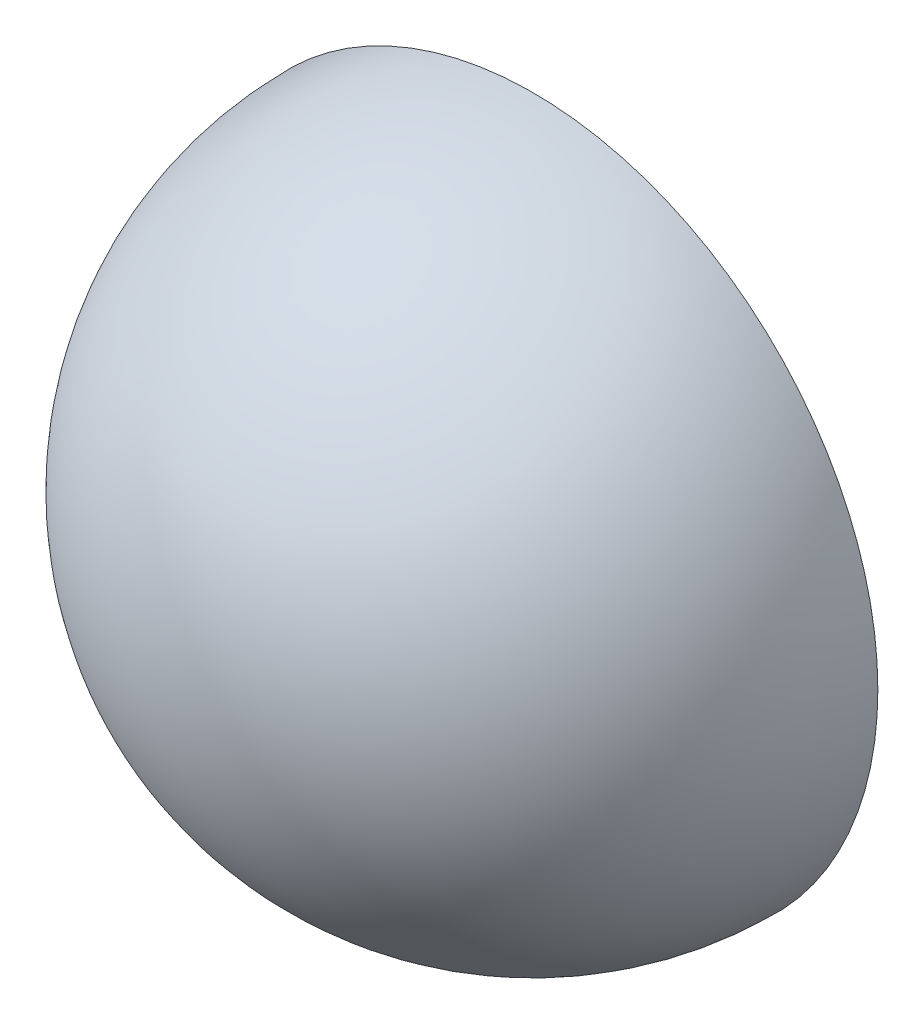
ISO-10303-21;
HEADER;
FILE_DESCRIPTION(('STEP AP214'),'2;1');
FILE_NAME('part.step','',(''),(''),'','','');
FILE_SCHEMA(('AUTOMOTIVE_DESIGN { 1 0 10303 214 1 1 1 1 }'));
ENDSEC;
DATA;
#1=APPLICATION_CONTEXT('core data for automotive mechanical design processes');
#2=APPLICATION_PROTOCOL_DEFINITION('international standard','automotive_design',2000,#1);
#3=PRODUCT_CONTEXT('',#1,'mechanical');
#4=PRODUCT('Part','Part','',(#3));
#5=PRODUCT_RELATED_PRODUCT_CATEGORY('part','',(#4));
#6=PRODUCT_DEFINITION_FORMATION('','',#4);
#7=PRODUCT_DEFINITION_CONTEXT('part definition',#1,'design');
#8=PRODUCT_DEFINITION('design','',#6,#7);
#9=PRODUCT_DEFINITION_SHAPE('','',#8);
#10=(LENGTH_UNIT() NAMED_UNIT(*) SI_UNIT(.MILLI.,.METRE.));
#11=(NAMED_UNIT(*) PLANE_ANGLE_UNIT() SI_UNIT($,.RADIAN.));
#12=(NAMED_UNIT(*) SI_UNIT($,.STERADIAN.) SOLID_ANGLE_UNIT());
#13=UNCERTAINTY_MEASURE_WITH_UNIT(LENGTH_MEASURE(1.E-05),#10,'distance_accuracy_value','');
#14=(GEOMETRIC_REPRESENTATION_CONTEXT(3) GLOBAL_UNCERTAINTY_ASSIGNED_CONTEXT((#13)) GLOBAL_UNIT_ASSIGNED_CONTEXT((#10,
#11,#12)) REPRESENTATION_CONTEXT('',''));
#15=CARTESIAN_POINT('',(0.,0.,0.));
#16=DIRECTION('',(0.,0.,1.));
#17=DIRECTION('',(1.,0.,0.));
#18=AXIS2_PLACEMENT_3D('',#15,#16,#17);
#19=CARTESIAN_POINT('',(0.,30.,0.));
#20=DIRECTION('',(0.,-1.,0.));
#21=DIRECTION('',(-1.,0.,0.));
#22=AXIS2_PLACEMENT_3D('',#19,#20,#21);
#23=SPHERICAL_SURFACE('',#22,15.);
#24=CARTESIAN_POINT('',(0.,30.,0.));
#25=DIRECTION('',(0.,0.,1.));
#26=DIRECTION('',(1.,0.,0.));
#27=AXIS2_PLACEMENT_3D('',#24,#25,#26);
#28=SPHERICAL_SURFACE('',#27,15.);
#29=CARTESIAN_POINT('',(0.,30.,0.));
#30=DIRECTION('',(0.,0.,1.));
#31=DIRECTION('',(1.,0.,0.));
#32=AXIS2_PLACEMENT_3D('',#29,#30,#31);
#33=CIRCLE('',#32,15.);
#34=CARTESIAN_POINT('',(15.,30.,0.));
#35=VERTEX_POINT('',#34);
#36=EDGE_CURVE('E37',#35,#35,#33,.F.);
#37=ORIENTED_EDGE('',*,*,#36,.T.);
#38=EDGE_LOOP('',(#37));
#39=FACE_BOUND('',#38,.T.);
#40=ADVANCED_FACE('F33',(#39),#28,.F.);
#41=CARTESIAN_POINT('',(0.,0.,0.));
#42=DIRECTION('',(0.,0.,1.));
#43=DIRECTION('',(1.,0.,0.));
#44=AXIS2_PLACEMENT_3D('',#41,#42,#43);
#45=PLANE('',#44);
#46=ORIENTED_EDGE('',*,*,#36,.F.);
#47=EDGE_LOOP('',(#46));
#48=FACE_BOUND('',#47,.T.);
#49=CARTESIAN_POINT('',(0.,30.,0.));
#50=DIRECTION('',(0.,0.,1.));
#51=DIRECTION('',(1.,0.,0.));
#52=AXIS2_PLACEMENT_3D('',#49,#50,#51);
#53=CIRCLE('',#52,30.);
#54=CARTESIAN_POINT('',(30.,30.,0.));
#55=VERTEX_POINT('',#54);
#56=EDGE_CURVE('E10',#55,#55,#53,.T.);
#57=ORIENTED_EDGE('',*,*,#56,.F.);
#58=EDGE_LOOP('',(#57));
#59=FACE_BOUND('',#58,.T.);
#60=ADVANCED_FACE('F47',(#48,#59),#45,.F.);
#61=CARTESIAN_POINT('',(0.,30.,0.));
#62=DIRECTION('',(0.,-1.,0.));
#63=DIRECTION('',(-1.,0.,0.));
#64=AXIS2_PLACEMENT_3D('',#61,#62,#63);
#65=SPHERICAL_SURFACE('',#64,30.);
#66=CARTESIAN_POINT('',(0.,30.,0.));
#67=DIRECTION('',(0.,0.,1.));
#68=DIRECTION('',(1.,0.,0.));
#69=AXIS2_PLACEMENT_3D('',#66,#67,#68);
#70=SPHERICAL_SURFACE('',#69,30.);
#71=ORIENTED_EDGE('',*,*,#56,.T.);
#72=EDGE_LOOP('',(#71));
#73=FACE_BOUND('',#72,.T.);
#74=ADVANCED_FACE('F35',(#73),#70,.T.);
#75=CLOSED_SHELL('',(#40,#60,#74));
#76=MANIFOLD_SOLID_BREP('B2',#75);
#77=ADVANCED_BREP_SHAPE_REPRESENTATION('',(#18,#76),#14);
#78=SHAPE_DEFINITION_REPRESENTATION(#9,#77);
ENDSEC;
END-ISO-10303-21;
